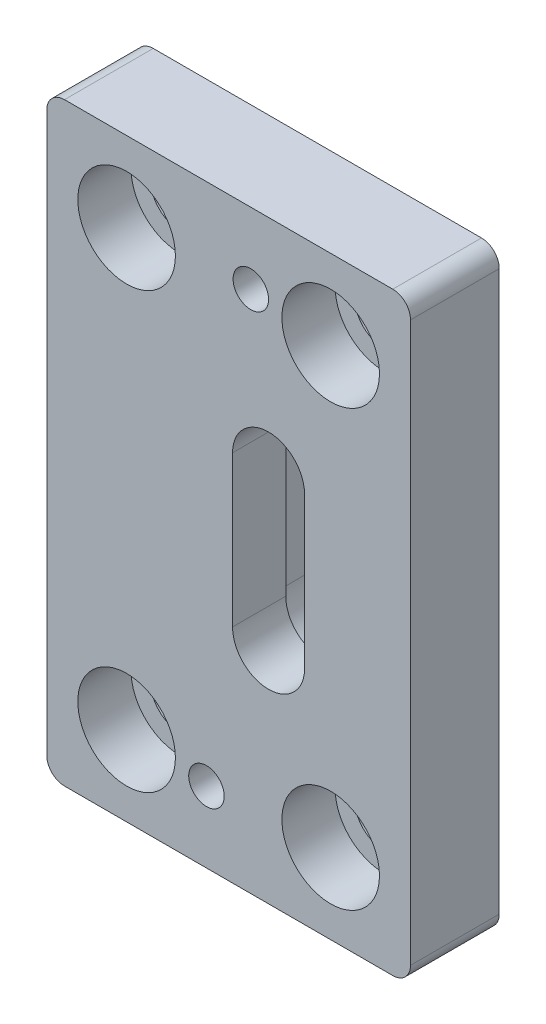
ISO-10303-21;
HEADER;
FILE_DESCRIPTION(('STEP AP214'),'2;1');
FILE_NAME('part.step','',(''),(''),'','','');
FILE_SCHEMA(('AUTOMOTIVE_DESIGN { 1 0 10303 214 1 1 1 1 }'));
ENDSEC;
DATA;
#1=APPLICATION_CONTEXT('core data for automotive mechanical design processes');
#2=APPLICATION_PROTOCOL_DEFINITION('international standard','automotive_design',2000,#1);
#3=PRODUCT_CONTEXT('',#1,'mechanical');
#4=PRODUCT('Part','Part','',(#3));
#5=PRODUCT_RELATED_PRODUCT_CATEGORY('part','',(#4));
#6=PRODUCT_DEFINITION_FORMATION('','',#4);
#7=PRODUCT_DEFINITION_CONTEXT('part definition',#1,'design');
#8=PRODUCT_DEFINITION('design','',#6,#7);
#9=PRODUCT_DEFINITION_SHAPE('','',#8);
#10=(LENGTH_UNIT() NAMED_UNIT(*) SI_UNIT(.MILLI.,.METRE.));
#11=(NAMED_UNIT(*) PLANE_ANGLE_UNIT() SI_UNIT($,.RADIAN.));
#12=(NAMED_UNIT(*) SI_UNIT($,.STERADIAN.) SOLID_ANGLE_UNIT());
#13=UNCERTAINTY_MEASURE_WITH_UNIT(LENGTH_MEASURE(1.E-05),#10,'distance_accuracy_value','');
#14=(GEOMETRIC_REPRESENTATION_CONTEXT(3) GLOBAL_UNCERTAINTY_ASSIGNED_CONTEXT((#13)) GLOBAL_UNIT_ASSIGNED_CONTEXT((#10,
#11,#12)) REPRESENTATION_CONTEXT('',''));
#15=CARTESIAN_POINT('',(0.,0.,0.));
#16=DIRECTION('',(0.,0.,1.));
#17=DIRECTION('',(1.,0.,0.));
#18=AXIS2_PLACEMENT_3D('',#15,#16,#17);
#19=CARTESIAN_POINT('',(-23.,45.,-10.));
#20=DIRECTION('',(0.,0.,1.));
#21=DIRECTION('',(1.,0.,0.));
#22=AXIS2_PLACEMENT_3D('',#19,#20,#21);
#23=CYLINDRICAL_SURFACE('',#22,2.);
#24=CARTESIAN_POINT('',(-23.,45.,0.));
#25=DIRECTION('',(0.,0.,1.));
#26=DIRECTION('',(1.,0.,0.));
#27=AXIS2_PLACEMENT_3D('',#24,#25,#26);
#28=CIRCLE('',#27,2.);
#29=CARTESIAN_POINT('',(-23.,47.,0.));
#30=VERTEX_POINT('',#29);
#31=CARTESIAN_POINT('',(-25.,45.,0.));
#32=VERTEX_POINT('',#31);
#33=EDGE_CURVE('E215',#30,#32,#28,.T.);
#34=ORIENTED_EDGE('',*,*,#33,.F.);
#35=DIRECTION('',(0.,0.,1.));
#36=VECTOR('',#35,1.);
#37=CARTESIAN_POINT('',(-23.,47.,-10.));
#38=LINE('',#37,#36);
#39=CARTESIAN_POINT('',(-23.,47.,-10.));
#40=VERTEX_POINT('',#39);
#41=EDGE_CURVE('E46',#40,#30,#38,.T.);
#42=ORIENTED_EDGE('',*,*,#41,.F.);
#43=CARTESIAN_POINT('',(-23.,45.,-10.));
#44=DIRECTION('',(0.,0.,1.));
#45=DIRECTION('',(1.,0.,0.));
#46=AXIS2_PLACEMENT_3D('',#43,#44,#45);
#47=CIRCLE('',#46,2.);
#48=CARTESIAN_POINT('',(-25.,45.,-10.));
#49=VERTEX_POINT('',#48);
#50=EDGE_CURVE('E221',#40,#49,#47,.T.);
#51=ORIENTED_EDGE('',*,*,#50,.T.);
#52=DIRECTION('',(0.,0.,1.));
#53=VECTOR('',#52,1.);
#54=CARTESIAN_POINT('',(-25.,45.,-10.));
#55=LINE('',#54,#53);
#56=EDGE_CURVE('E246',#49,#32,#55,.T.);
#57=ORIENTED_EDGE('',*,*,#56,.T.);
#58=EDGE_LOOP('',(#34,#42,#51,#57));
#59=FACE_BOUND('',#58,.T.);
#60=ADVANCED_FACE('F39',(#59),#23,.T.);
#61=CARTESIAN_POINT('',(-23.,47.,-10.));
#62=DIRECTION('',(0.,1.,0.));
#63=DIRECTION('',(0.,0.,1.));
#64=AXIS2_PLACEMENT_3D('',#61,#62,#63);
#65=PLANE('',#64);
#66=DIRECTION('',(-1.,0.,0.));
#67=VECTOR('',#66,1.);
#68=CARTESIAN_POINT('',(-23.,47.,0.));
#69=LINE('',#68,#67);
#70=CARTESIAN_POINT('',(14.,47.,0.));
#71=VERTEX_POINT('',#70);
#72=EDGE_CURVE('E225',#71,#30,#69,.T.);
#73=ORIENTED_EDGE('',*,*,#72,.F.);
#74=DIRECTION('',(0.,0.,1.));
#75=VECTOR('',#74,1.);
#76=CARTESIAN_POINT('',(14.,47.,-10.));
#77=LINE('',#76,#75);
#78=CARTESIAN_POINT('',(14.,47.,-10.));
#79=VERTEX_POINT('',#78);
#80=EDGE_CURVE('E270',#79,#71,#77,.T.);
#81=ORIENTED_EDGE('',*,*,#80,.F.);
#82=DIRECTION('',(-1.,0.,0.));
#83=VECTOR('',#82,1.);
#84=CARTESIAN_POINT('',(-23.,47.,-10.));
#85=LINE('',#84,#83);
#86=EDGE_CURVE('E243',#79,#40,#85,.T.);
#87=ORIENTED_EDGE('',*,*,#86,.T.);
#88=ORIENTED_EDGE('',*,*,#41,.T.);
#89=EDGE_LOOP('',(#73,#81,#87,#88));
#90=FACE_BOUND('',#89,.T.);
#91=ADVANCED_FACE('F294',(#90),#65,.T.);
#92=CARTESIAN_POINT('',(14.,45.,-10.));
#93=DIRECTION('',(0.,0.,1.));
#94=DIRECTION('',(1.,0.,0.));
#95=AXIS2_PLACEMENT_3D('',#92,#93,#94);
#96=CYLINDRICAL_SURFACE('',#95,2.);
#97=CARTESIAN_POINT('',(14.,45.,0.));
#98=DIRECTION('',(0.,0.,1.));
#99=DIRECTION('',(-1.,0.,0.));
#100=AXIS2_PLACEMENT_3D('',#97,#98,#99);
#101=CIRCLE('',#100,2.);
#102=CARTESIAN_POINT('',(16.,45.,0.));
#103=VERTEX_POINT('',#102);
#104=EDGE_CURVE('E264',#103,#71,#101,.T.);
#105=ORIENTED_EDGE('',*,*,#104,.F.);
#106=DIRECTION('',(0.,0.,1.));
#107=VECTOR('',#106,1.);
#108=CARTESIAN_POINT('',(16.,45.,-10.));
#109=LINE('',#108,#107);
#110=CARTESIAN_POINT('',(16.,45.,-10.));
#111=VERTEX_POINT('',#110);
#112=EDGE_CURVE('E272',#111,#103,#109,.T.);
#113=ORIENTED_EDGE('',*,*,#112,.F.);
#114=CARTESIAN_POINT('',(14.,45.,-10.));
#115=DIRECTION('',(0.,0.,1.));
#116=DIRECTION('',(-1.,0.,0.));
#117=AXIS2_PLACEMENT_3D('',#114,#115,#116);
#118=CIRCLE('',#117,2.);
#119=EDGE_CURVE('E240',#111,#79,#118,.T.);
#120=ORIENTED_EDGE('',*,*,#119,.T.);
#121=ORIENTED_EDGE('',*,*,#80,.T.);
#122=EDGE_LOOP('',(#105,#113,#120,#121));
#123=FACE_BOUND('',#122,.T.);
#124=ADVANCED_FACE('F313',(#123),#96,.T.);
#125=CARTESIAN_POINT('',(16.,45.,-10.));
#126=DIRECTION('',(1.,0.,0.));
#127=DIRECTION('',(0.,0.,-1.));
#128=AXIS2_PLACEMENT_3D('',#125,#126,#127);
#129=PLANE('',#128);
#130=DIRECTION('',(0.,1.,0.));
#131=VECTOR('',#130,1.);
#132=CARTESIAN_POINT('',(16.,45.,0.));
#133=LINE('',#132,#131);
#134=CARTESIAN_POINT('',(16.,-18.,0.));
#135=VERTEX_POINT('',#134);
#136=EDGE_CURVE('E261',#135,#103,#133,.T.);
#137=ORIENTED_EDGE('',*,*,#136,.F.);
#138=DIRECTION('',(0.,0.,1.));
#139=VECTOR('',#138,1.);
#140=CARTESIAN_POINT('',(16.,-18.,-10.));
#141=LINE('',#140,#139);
#142=CARTESIAN_POINT('',(16.,-18.,-10.));
#143=VERTEX_POINT('',#142);
#144=EDGE_CURVE('E274',#143,#135,#141,.T.);
#145=ORIENTED_EDGE('',*,*,#144,.F.);
#146=DIRECTION('',(0.,1.,0.));
#147=VECTOR('',#146,1.);
#148=CARTESIAN_POINT('',(16.,45.,-10.));
#149=LINE('',#148,#147);
#150=EDGE_CURVE('E237',#143,#111,#149,.T.);
#151=ORIENTED_EDGE('',*,*,#150,.T.);
#152=ORIENTED_EDGE('',*,*,#112,.T.);
#153=EDGE_LOOP('',(#137,#145,#151,#152));
#154=FACE_BOUND('',#153,.T.);
#155=ADVANCED_FACE('F311',(#154),#129,.T.);
#156=CARTESIAN_POINT('',(14.,-18.,-10.));
#157=DIRECTION('',(0.,0.,1.));
#158=DIRECTION('',(1.,0.,0.));
#159=AXIS2_PLACEMENT_3D('',#156,#157,#158);
#160=CYLINDRICAL_SURFACE('',#159,2.);
#161=CARTESIAN_POINT('',(14.,-18.,0.));
#162=DIRECTION('',(0.,0.,1.));
#163=DIRECTION('',(1.,0.,0.));
#164=AXIS2_PLACEMENT_3D('',#161,#162,#163);
#165=CIRCLE('',#164,2.);
#166=CARTESIAN_POINT('',(14.,-20.,0.));
#167=VERTEX_POINT('',#166);
#168=EDGE_CURVE('E258',#167,#135,#165,.T.);
#169=ORIENTED_EDGE('',*,*,#168,.F.);
#170=DIRECTION('',(0.,0.,1.));
#171=VECTOR('',#170,1.);
#172=CARTESIAN_POINT('',(14.,-20.,-10.));
#173=LINE('',#172,#171);
#174=CARTESIAN_POINT('',(14.,-20.,-10.));
#175=VERTEX_POINT('',#174);
#176=EDGE_CURVE('E276',#175,#167,#173,.T.);
#177=ORIENTED_EDGE('',*,*,#176,.F.);
#178=CARTESIAN_POINT('',(14.,-18.,-10.));
#179=DIRECTION('',(0.,0.,1.));
#180=DIRECTION('',(1.,0.,0.));
#181=AXIS2_PLACEMENT_3D('',#178,#179,#180);
#182=CIRCLE('',#181,2.);
#183=EDGE_CURVE('E234',#175,#143,#182,.T.);
#184=ORIENTED_EDGE('',*,*,#183,.T.);
#185=ORIENTED_EDGE('',*,*,#144,.T.);
#186=EDGE_LOOP('',(#169,#177,#184,#185));
#187=FACE_BOUND('',#186,.T.);
#188=ADVANCED_FACE('F307',(#187),#160,.T.);
#189=CARTESIAN_POINT('',(-23.,-20.,-10.));
#190=DIRECTION('',(0.,-1.,0.));
#191=DIRECTION('',(0.,0.,-1.));
#192=AXIS2_PLACEMENT_3D('',#189,#190,#191);
#193=PLANE('',#192);
#194=DIRECTION('',(1.,0.,0.));
#195=VECTOR('',#194,1.);
#196=CARTESIAN_POINT('',(-23.,-20.,0.));
#197=LINE('',#196,#195);
#198=CARTESIAN_POINT('',(-23.,-20.,0.));
#199=VERTEX_POINT('',#198);
#200=EDGE_CURVE('E255',#199,#167,#197,.T.);
#201=ORIENTED_EDGE('',*,*,#200,.F.);
#202=DIRECTION('',(0.,0.,1.));
#203=VECTOR('',#202,1.);
#204=CARTESIAN_POINT('',(-23.,-20.,-10.));
#205=LINE('',#204,#203);
#206=CARTESIAN_POINT('',(-23.,-20.,-10.));
#207=VERTEX_POINT('',#206);
#208=EDGE_CURVE('E278',#207,#199,#205,.T.);
#209=ORIENTED_EDGE('',*,*,#208,.F.);
#210=DIRECTION('',(1.,0.,0.));
#211=VECTOR('',#210,1.);
#212=CARTESIAN_POINT('',(-23.,-20.,-10.));
#213=LINE('',#212,#211);
#214=EDGE_CURVE('E231',#207,#175,#213,.T.);
#215=ORIENTED_EDGE('',*,*,#214,.T.);
#216=ORIENTED_EDGE('',*,*,#176,.T.);
#217=EDGE_LOOP('',(#201,#209,#215,#216));
#218=FACE_BOUND('',#217,.T.);
#219=ADVANCED_FACE('F305',(#218),#193,.T.);
#220=CARTESIAN_POINT('',(-23.,-18.,-10.));
#221=DIRECTION('',(0.,0.,1.));
#222=DIRECTION('',(1.,0.,0.));
#223=AXIS2_PLACEMENT_3D('',#220,#221,#222);
#224=CYLINDRICAL_SURFACE('',#223,2.);
#225=CARTESIAN_POINT('',(-23.,-18.,0.));
#226=DIRECTION('',(0.,0.,1.));
#227=DIRECTION('',(1.,0.,0.));
#228=AXIS2_PLACEMENT_3D('',#225,#226,#227);
#229=CIRCLE('',#228,2.);
#230=CARTESIAN_POINT('',(-25.,-18.,0.));
#231=VERTEX_POINT('',#230);
#232=EDGE_CURVE('E252',#231,#199,#229,.T.);
#233=ORIENTED_EDGE('',*,*,#232,.F.);
#234=DIRECTION('',(0.,0.,1.));
#235=VECTOR('',#234,1.);
#236=CARTESIAN_POINT('',(-25.,-18.,-10.));
#237=LINE('',#236,#235);
#238=CARTESIAN_POINT('',(-25.,-18.,-10.));
#239=VERTEX_POINT('',#238);
#240=EDGE_CURVE('E280',#239,#231,#237,.T.);
#241=ORIENTED_EDGE('',*,*,#240,.F.);
#242=CARTESIAN_POINT('',(-23.,-18.,-10.));
#243=DIRECTION('',(0.,0.,1.));
#244=DIRECTION('',(1.,0.,0.));
#245=AXIS2_PLACEMENT_3D('',#242,#243,#244);
#246=CIRCLE('',#245,2.);
#247=EDGE_CURVE('E228',#239,#207,#246,.T.);
#248=ORIENTED_EDGE('',*,*,#247,.T.);
#249=ORIENTED_EDGE('',*,*,#208,.T.);
#250=EDGE_LOOP('',(#233,#241,#248,#249));
#251=FACE_BOUND('',#250,.T.);
#252=ADVANCED_FACE('F301',(#251),#224,.T.);
#253=CARTESIAN_POINT('',(-25.,45.,-10.));
#254=DIRECTION('',(-1.,0.,0.));
#255=DIRECTION('',(0.,-1.,0.));
#256=AXIS2_PLACEMENT_3D('',#253,#254,#255);
#257=PLANE('',#256);
#258=DIRECTION('',(0.,-1.,0.));
#259=VECTOR('',#258,1.);
#260=CARTESIAN_POINT('',(-25.,45.,0.));
#261=LINE('',#260,#259);
#262=EDGE_CURVE('E249',#32,#231,#261,.T.);
#263=ORIENTED_EDGE('',*,*,#262,.F.);
#264=ORIENTED_EDGE('',*,*,#56,.F.);
#265=DIRECTION('',(0.,-1.,0.));
#266=VECTOR('',#265,1.);
#267=CARTESIAN_POINT('',(-25.,45.,-10.));
#268=LINE('',#267,#266);
#269=EDGE_CURVE('E224',#49,#239,#268,.T.);
#270=ORIENTED_EDGE('',*,*,#269,.T.);
#271=ORIENTED_EDGE('',*,*,#240,.T.);
#272=EDGE_LOOP('',(#263,#264,#270,#271));
#273=FACE_BOUND('',#272,.T.);
#274=ADVANCED_FACE('F287',(#273),#257,.T.);
#275=CARTESIAN_POINT('',(-23.,45.,-10.));
#276=DIRECTION('',(0.,0.,1.));
#277=DIRECTION('',(1.,0.,0.));
#278=AXIS2_PLACEMENT_3D('',#275,#276,#277);
#279=PLANE('',#278);
#280=CARTESIAN_POINT('',(-2.,39.,-10.));
#281=DIRECTION('',(0.,0.,1.));
#282=DIRECTION('',(1.,0.,0.));
#283=AXIS2_PLACEMENT_3D('',#280,#281,#282);
#284=CIRCLE('',#283,1.99999999999999);
#285=CARTESIAN_POINT('',(0.,39.,-10.));
#286=VERTEX_POINT('',#285);
#287=EDGE_CURVE('E688',#286,#286,#284,.T.);
#288=ORIENTED_EDGE('',*,*,#287,.T.);
#289=EDGE_LOOP('',(#288));
#290=FACE_BOUND('',#289,.T.);
#291=CARTESIAN_POINT('',(-7.,-12.,-10.));
#292=DIRECTION('',(0.,0.,1.));
#293=DIRECTION('',(1.,0.,0.));
#294=AXIS2_PLACEMENT_3D('',#291,#292,#293);
#295=CIRCLE('',#294,1.99999999999999);
#296=CARTESIAN_POINT('',(-5.00000000000002,-12.,-10.));
#297=VERTEX_POINT('',#296);
#298=EDGE_CURVE('E698',#297,#297,#295,.T.);
#299=ORIENTED_EDGE('',*,*,#298,.T.);
#300=EDGE_LOOP('',(#299));
#301=FACE_BOUND('',#300,.T.);
#302=CARTESIAN_POINT('',(-16.,38.,-10.));
#303=DIRECTION('',(0.,0.,1.));
#304=DIRECTION('',(1.,0.,0.));
#305=AXIS2_PLACEMENT_3D('',#302,#303,#304);
#306=CIRCLE('',#305,3.3);
#307=CARTESIAN_POINT('',(-12.7,38.,-10.));
#308=VERTEX_POINT('',#307);
#309=EDGE_CURVE('E710',#308,#308,#306,.T.);
#310=ORIENTED_EDGE('',*,*,#309,.T.);
#311=EDGE_LOOP('',(#310));
#312=FACE_BOUND('',#311,.T.);
#313=CARTESIAN_POINT('',(7.,-11.,-10.));
#314=DIRECTION('',(0.,0.,1.));
#315=DIRECTION('',(1.,0.,0.));
#316=AXIS2_PLACEMENT_3D('',#313,#314,#315);
#317=CIRCLE('',#316,3.3);
#318=CARTESIAN_POINT('',(10.3,-11.,-10.));
#319=VERTEX_POINT('',#318);
#320=EDGE_CURVE('E722',#319,#319,#317,.T.);
#321=ORIENTED_EDGE('',*,*,#320,.T.);
#322=EDGE_LOOP('',(#321));
#323=FACE_BOUND('',#322,.T.);
#324=CARTESIAN_POINT('',(-16.,-11.,-10.));
#325=DIRECTION('',(0.,0.,1.));
#326=DIRECTION('',(1.,0.,0.));
#327=AXIS2_PLACEMENT_3D('',#324,#325,#326);
#328=CIRCLE('',#327,3.3);
#329=CARTESIAN_POINT('',(-12.7,-11.,-10.));
#330=VERTEX_POINT('',#329);
#331=EDGE_CURVE('E734',#330,#330,#328,.T.);
#332=ORIENTED_EDGE('',*,*,#331,.T.);
#333=EDGE_LOOP('',(#332));
#334=FACE_BOUND('',#333,.T.);
#335=CARTESIAN_POINT('',(7.00000000000001,38.,-10.));
#336=DIRECTION('',(0.,0.,1.));
#337=DIRECTION('',(1.,0.,0.));
#338=AXIS2_PLACEMENT_3D('',#335,#336,#337);
#339=CIRCLE('',#338,3.3);
#340=CARTESIAN_POINT('',(10.3,38.,-10.));
#341=VERTEX_POINT('',#340);
#342=EDGE_CURVE('E178',#341,#341,#339,.T.);
#343=ORIENTED_EDGE('',*,*,#342,.T.);
#344=EDGE_LOOP('',(#343));
#345=FACE_BOUND('',#344,.T.);
#346=DIRECTION('',(0.,1.,0.));
#347=VECTOR('',#346,1.);
#348=CARTESIAN_POINT('',(5.06,5.00000000000001,-10.));
#349=LINE('',#348,#347);
#350=CARTESIAN_POINT('',(5.06,5.00000000000001,-10.));
#351=VERTEX_POINT('',#350);
#352=CARTESIAN_POINT('',(5.06,22.,-10.));
#353=VERTEX_POINT('',#352);
#354=EDGE_CURVE('E162',#351,#353,#349,.T.);
#355=ORIENTED_EDGE('',*,*,#354,.T.);
#356=CARTESIAN_POINT('',(0.,22.,-10.));
#357=DIRECTION('',(0.,0.,1.));
#358=DIRECTION('',(1.,0.,0.));
#359=AXIS2_PLACEMENT_3D('',#356,#357,#358);
#360=CIRCLE('',#359,5.06);
#361=CARTESIAN_POINT('',(-5.06000000000001,22.,-10.));
#362=VERTEX_POINT('',#361);
#363=EDGE_CURVE('E154',#353,#362,#360,.T.);
#364=ORIENTED_EDGE('',*,*,#363,.T.);
#365=DIRECTION('',(0.,-1.,0.));
#366=VECTOR('',#365,1.);
#367=CARTESIAN_POINT('',(-5.06000000000001,22.,-10.));
#368=LINE('',#367,#366);
#369=CARTESIAN_POINT('',(-5.06,5.00000000000002,-10.));
#370=VERTEX_POINT('',#369);
#371=EDGE_CURVE('E165',#362,#370,#368,.T.);
#372=ORIENTED_EDGE('',*,*,#371,.T.);
#373=CARTESIAN_POINT('',(0.,5.00000000000001,-10.));
#374=DIRECTION('',(0.,0.,1.));
#375=DIRECTION('',(1.,0.,0.));
#376=AXIS2_PLACEMENT_3D('',#373,#374,#375);
#377=CIRCLE('',#376,5.06);
#378=EDGE_CURVE('E53',#370,#351,#377,.T.);
#379=ORIENTED_EDGE('',*,*,#378,.T.);
#380=EDGE_LOOP('',(#355,#364,#372,#379));
#381=FACE_BOUND('',#380,.T.);
#382=ORIENTED_EDGE('',*,*,#50,.F.);
#383=ORIENTED_EDGE('',*,*,#86,.F.);
#384=ORIENTED_EDGE('',*,*,#119,.F.);
#385=ORIENTED_EDGE('',*,*,#150,.F.);
#386=ORIENTED_EDGE('',*,*,#183,.F.);
#387=ORIENTED_EDGE('',*,*,#214,.F.);
#388=ORIENTED_EDGE('',*,*,#247,.F.);
#389=ORIENTED_EDGE('',*,*,#269,.F.);
#390=EDGE_LOOP('',(#382,#383,#384,#385,#386,#387,#388,#389));
#391=FACE_BOUND('',#390,.T.);
#392=ADVANCED_FACE('F169',(#290,#301,#312,#323,#334,#345,#381,#391),#279,.F.);
#393=CARTESIAN_POINT('',(-23.,45.,0.));
#394=DIRECTION('',(0.,0.,1.));
#395=DIRECTION('',(1.,0.,0.));
#396=AXIS2_PLACEMENT_3D('',#393,#394,#395);
#397=PLANE('',#396);
#398=CARTESIAN_POINT('',(-2.,39.,0.));
#399=DIRECTION('',(0.,0.,1.));
#400=DIRECTION('',(1.,0.,0.));
#401=AXIS2_PLACEMENT_3D('',#398,#399,#400);
#402=CIRCLE('',#401,1.99999999999999);
#403=CARTESIAN_POINT('',(0.,39.,0.));
#404=VERTEX_POINT('',#403);
#405=EDGE_CURVE('E691',#404,#404,#402,.T.);
#406=ORIENTED_EDGE('',*,*,#405,.F.);
#407=EDGE_LOOP('',(#406));
#408=FACE_BOUND('',#407,.T.);
#409=CARTESIAN_POINT('',(-7.,-12.,0.));
#410=DIRECTION('',(0.,0.,1.));
#411=DIRECTION('',(1.,0.,0.));
#412=AXIS2_PLACEMENT_3D('',#409,#410,#411);
#413=CIRCLE('',#412,1.99999999999999);
#414=CARTESIAN_POINT('',(-5.00000000000002,-12.,0.));
#415=VERTEX_POINT('',#414);
#416=EDGE_CURVE('E693',#415,#415,#413,.T.);
#417=ORIENTED_EDGE('',*,*,#416,.F.);
#418=EDGE_LOOP('',(#417));
#419=FACE_BOUND('',#418,.T.);
#420=CARTESIAN_POINT('',(-16.,38.,0.));
#421=DIRECTION('',(0.,0.,1.));
#422=DIRECTION('',(1.,0.,0.));
#423=AXIS2_PLACEMENT_3D('',#420,#421,#422);
#424=CIRCLE('',#423,5.49999999999999);
#425=CARTESIAN_POINT('',(-10.5,38.,0.));
#426=VERTEX_POINT('',#425);
#427=EDGE_CURVE('E701',#426,#426,#424,.T.);
#428=ORIENTED_EDGE('',*,*,#427,.F.);
#429=EDGE_LOOP('',(#428));
#430=FACE_BOUND('',#429,.T.);
#431=CARTESIAN_POINT('',(7.,-11.,0.));
#432=DIRECTION('',(0.,0.,1.));
#433=DIRECTION('',(1.,0.,0.));
#434=AXIS2_PLACEMENT_3D('',#431,#432,#433);
#435=CIRCLE('',#434,5.49999999999999);
#436=CARTESIAN_POINT('',(12.5,-11.,0.));
#437=VERTEX_POINT('',#436);
#438=EDGE_CURVE('E713',#437,#437,#435,.T.);
#439=ORIENTED_EDGE('',*,*,#438,.F.);
#440=EDGE_LOOP('',(#439));
#441=FACE_BOUND('',#440,.T.);
#442=CARTESIAN_POINT('',(-16.,-11.,0.));
#443=DIRECTION('',(0.,0.,1.));
#444=DIRECTION('',(1.,0.,0.));
#445=AXIS2_PLACEMENT_3D('',#442,#443,#444);
#446=CIRCLE('',#445,5.49999999999999);
#447=CARTESIAN_POINT('',(-10.5,-11.,0.));
#448=VERTEX_POINT('',#447);
#449=EDGE_CURVE('E725',#448,#448,#446,.T.);
#450=ORIENTED_EDGE('',*,*,#449,.F.);
#451=EDGE_LOOP('',(#450));
#452=FACE_BOUND('',#451,.T.);
#453=CARTESIAN_POINT('',(7.00000000000001,38.,0.));
#454=DIRECTION('',(0.,0.,1.));
#455=DIRECTION('',(1.,0.,0.));
#456=AXIS2_PLACEMENT_3D('',#453,#454,#455);
#457=CIRCLE('',#456,5.49999999999999);
#458=CARTESIAN_POINT('',(12.5,38.,0.));
#459=VERTEX_POINT('',#458);
#460=EDGE_CURVE('E737',#459,#459,#457,.T.);
#461=ORIENTED_EDGE('',*,*,#460,.F.);
#462=EDGE_LOOP('',(#461));
#463=FACE_BOUND('',#462,.T.);
#464=CARTESIAN_POINT('',(0.,22.,0.));
#465=DIRECTION('',(0.,0.,1.));
#466=DIRECTION('',(1.,0.,0.));
#467=AXIS2_PLACEMENT_3D('',#464,#465,#466);
#468=CIRCLE('',#467,4.06);
#469=CARTESIAN_POINT('',(4.06,22.,0.));
#470=VERTEX_POINT('',#469);
#471=CARTESIAN_POINT('',(-4.06000000000001,22.,0.));
#472=VERTEX_POINT('',#471);
#473=EDGE_CURVE('E200',#470,#472,#468,.T.);
#474=ORIENTED_EDGE('',*,*,#473,.F.);
#475=DIRECTION('',(0.,1.,0.));
#476=VECTOR('',#475,1.);
#477=CARTESIAN_POINT('',(4.06,5.00000000000001,0.));
#478=LINE('',#477,#476);
#479=CARTESIAN_POINT('',(4.06,5.00000000000001,0.));
#480=VERTEX_POINT('',#479);
#481=EDGE_CURVE('E209',#480,#470,#478,.T.);
#482=ORIENTED_EDGE('',*,*,#481,.F.);
#483=CARTESIAN_POINT('',(0.,5.00000000000001,0.));
#484=DIRECTION('',(0.,0.,1.));
#485=DIRECTION('',(1.,0.,0.));
#486=AXIS2_PLACEMENT_3D('',#483,#484,#485);
#487=CIRCLE('',#486,4.06);
#488=CARTESIAN_POINT('',(-4.06,5.00000000000002,0.));
#489=VERTEX_POINT('',#488);
#490=EDGE_CURVE('E206',#489,#480,#487,.T.);
#491=ORIENTED_EDGE('',*,*,#490,.F.);
#492=DIRECTION('',(0.,-1.,0.));
#493=VECTOR('',#492,1.);
#494=CARTESIAN_POINT('',(-4.06,22.,0.));
#495=LINE('',#494,#493);
#496=EDGE_CURVE('E203',#472,#489,#495,.T.);
#497=ORIENTED_EDGE('',*,*,#496,.F.);
#498=EDGE_LOOP('',(#474,#482,#491,#497));
#499=FACE_BOUND('',#498,.T.);
#500=ORIENTED_EDGE('',*,*,#33,.T.);
#501=ORIENTED_EDGE('',*,*,#262,.T.);
#502=ORIENTED_EDGE('',*,*,#232,.T.);
#503=ORIENTED_EDGE('',*,*,#200,.T.);
#504=ORIENTED_EDGE('',*,*,#168,.T.);
#505=ORIENTED_EDGE('',*,*,#136,.T.);
#506=ORIENTED_EDGE('',*,*,#104,.T.);
#507=ORIENTED_EDGE('',*,*,#72,.T.);
#508=EDGE_LOOP('',(#500,#501,#502,#503,#504,#505,#506,#507));
#509=FACE_BOUND('',#508,.T.);
#510=ADVANCED_FACE('F290',(#408,#419,#430,#441,#452,#463,#499,#509),#397,.T.);
#511=CARTESIAN_POINT('',(0.,22.,-10.));
#512=DIRECTION('',(0.,0.,1.));
#513=DIRECTION('',(1.,0.,0.));
#514=AXIS2_PLACEMENT_3D('',#511,#512,#513);
#515=CYLINDRICAL_SURFACE('',#514,4.06);
#516=DIRECTION('',(0.,0.,1.));
#517=VECTOR('',#516,1.);
#518=CARTESIAN_POINT('',(-4.06,22.,-10.));
#519=LINE('',#518,#517);
#520=CARTESIAN_POINT('',(-4.06,22.,-6.));
#521=VERTEX_POINT('',#520);
#522=EDGE_CURVE('E212',#521,#472,#519,.T.);
#523=ORIENTED_EDGE('',*,*,#522,.F.);
#524=CARTESIAN_POINT('',(0.,22.,-6.));
#525=DIRECTION('',(0.,0.,1.));
#526=DIRECTION('',(1.,0.,0.));
#527=AXIS2_PLACEMENT_3D('',#524,#525,#526);
#528=CIRCLE('',#527,4.06);
#529=CARTESIAN_POINT('',(4.06,22.,-6.));
#530=VERTEX_POINT('',#529);
#531=EDGE_CURVE('E61',#521,#530,#528,.F.);
#532=ORIENTED_EDGE('',*,*,#531,.T.);
#533=DIRECTION('',(0.,0.,1.));
#534=VECTOR('',#533,1.);
#535=CARTESIAN_POINT('',(4.06,22.,-10.));
#536=LINE('',#535,#534);
#537=EDGE_CURVE('E213',#530,#470,#536,.T.);
#538=ORIENTED_EDGE('',*,*,#537,.T.);
#539=ORIENTED_EDGE('',*,*,#473,.T.);
#540=EDGE_LOOP('',(#523,#532,#538,#539));
#541=FACE_BOUND('',#540,.T.);
#542=ADVANCED_FACE('F384',(#541),#515,.F.);
#543=CARTESIAN_POINT('',(4.06,5.00000000000001,-10.));
#544=DIRECTION('',(1.,0.,0.));
#545=DIRECTION('',(0.,1.,0.));
#546=AXIS2_PLACEMENT_3D('',#543,#544,#545);
#547=PLANE('',#546);
#548=ORIENTED_EDGE('',*,*,#537,.F.);
#549=DIRECTION('',(0.,-1.,0.));
#550=VECTOR('',#549,1.);
#551=CARTESIAN_POINT('',(4.06,5.00000000000001,-6.));
#552=LINE('',#551,#550);
#553=CARTESIAN_POINT('',(4.06,5.00000000000001,-6.));
#554=VERTEX_POINT('',#553);
#555=EDGE_CURVE('E196',#530,#554,#552,.T.);
#556=ORIENTED_EDGE('',*,*,#555,.T.);
#557=DIRECTION('',(0.,0.,1.));
#558=VECTOR('',#557,1.);
#559=CARTESIAN_POINT('',(4.06,5.00000000000001,-10.));
#560=LINE('',#559,#558);
#561=EDGE_CURVE('E216',#554,#480,#560,.T.);
#562=ORIENTED_EDGE('',*,*,#561,.T.);
#563=ORIENTED_EDGE('',*,*,#481,.T.);
#564=EDGE_LOOP('',(#548,#556,#562,#563));
#565=FACE_BOUND('',#564,.T.);
#566=ADVANCED_FACE('F389',(#565),#547,.F.);
#567=CARTESIAN_POINT('',(0.,5.00000000000001,-10.));
#568=DIRECTION('',(0.,0.,1.));
#569=DIRECTION('',(1.,0.,0.));
#570=AXIS2_PLACEMENT_3D('',#567,#568,#569);
#571=CYLINDRICAL_SURFACE('',#570,4.06);
#572=ORIENTED_EDGE('',*,*,#561,.F.);
#573=CARTESIAN_POINT('',(0.,5.00000000000001,-6.));
#574=DIRECTION('',(0.,0.,1.));
#575=DIRECTION('',(1.,0.,0.));
#576=AXIS2_PLACEMENT_3D('',#573,#574,#575);
#577=CIRCLE('',#576,4.06);
#578=CARTESIAN_POINT('',(-4.06,5.00000000000002,-6.));
#579=VERTEX_POINT('',#578);
#580=EDGE_CURVE('E190',#554,#579,#577,.F.);
#581=ORIENTED_EDGE('',*,*,#580,.T.);
#582=DIRECTION('',(0.,0.,1.));
#583=VECTOR('',#582,1.);
#584=CARTESIAN_POINT('',(-4.06,5.00000000000002,-10.));
#585=LINE('',#584,#583);
#586=EDGE_CURVE('E218',#579,#489,#585,.T.);
#587=ORIENTED_EDGE('',*,*,#586,.T.);
#588=ORIENTED_EDGE('',*,*,#490,.T.);
#589=EDGE_LOOP('',(#572,#581,#587,#588));
#590=FACE_BOUND('',#589,.T.);
#591=ADVANCED_FACE('F402',(#590),#571,.F.);
#592=CARTESIAN_POINT('',(-4.06,22.,-10.));
#593=DIRECTION('',(-1.,0.,0.));
#594=DIRECTION('',(0.,-1.,0.));
#595=AXIS2_PLACEMENT_3D('',#592,#593,#594);
#596=PLANE('',#595);
#597=ORIENTED_EDGE('',*,*,#586,.F.);
#598=DIRECTION('',(0.,1.,0.));
#599=VECTOR('',#598,1.);
#600=CARTESIAN_POINT('',(-4.06,22.,-6.));
#601=LINE('',#600,#599);
#602=EDGE_CURVE('E11',#579,#521,#601,.T.);
#603=ORIENTED_EDGE('',*,*,#602,.T.);
#604=ORIENTED_EDGE('',*,*,#522,.T.);
#605=ORIENTED_EDGE('',*,*,#496,.T.);
#606=EDGE_LOOP('',(#597,#603,#604,#605));
#607=FACE_BOUND('',#606,.T.);
#608=ADVANCED_FACE('F413',(#607),#596,.F.);
#609=CARTESIAN_POINT('',(0.,22.,-6.));
#610=DIRECTION('',(0.,0.,1.));
#611=DIRECTION('',(1.,0.,0.));
#612=AXIS2_PLACEMENT_3D('',#609,#610,#611);
#613=PLANE('',#612);
#614=CARTESIAN_POINT('',(0.,22.,-6.));
#615=DIRECTION('',(0.,0.,1.));
#616=DIRECTION('',(1.,0.,0.));
#617=AXIS2_PLACEMENT_3D('',#614,#615,#616);
#618=CIRCLE('',#617,5.06);
#619=CARTESIAN_POINT('',(5.06,22.,-6.));
#620=VERTEX_POINT('',#619);
#621=CARTESIAN_POINT('',(-5.06000000000001,22.,-6.));
#622=VERTEX_POINT('',#621);
#623=EDGE_CURVE('E157',#620,#622,#618,.T.);
#624=ORIENTED_EDGE('',*,*,#623,.F.);
#625=DIRECTION('',(0.,1.,0.));
#626=VECTOR('',#625,1.);
#627=CARTESIAN_POINT('',(5.06,5.00000000000001,-6.));
#628=LINE('',#627,#626);
#629=CARTESIAN_POINT('',(5.06,5.00000000000001,-6.));
#630=VERTEX_POINT('',#629);
#631=EDGE_CURVE('E172',#630,#620,#628,.T.);
#632=ORIENTED_EDGE('',*,*,#631,.F.);
#633=CARTESIAN_POINT('',(0.,5.00000000000001,-6.));
#634=DIRECTION('',(0.,0.,1.));
#635=DIRECTION('',(1.,0.,0.));
#636=AXIS2_PLACEMENT_3D('',#633,#634,#635);
#637=CIRCLE('',#636,5.06);
#638=CARTESIAN_POINT('',(-5.06,5.00000000000002,-6.));
#639=VERTEX_POINT('',#638);
#640=EDGE_CURVE('E175',#639,#630,#637,.T.);
#641=ORIENTED_EDGE('',*,*,#640,.F.);
#642=DIRECTION('',(0.,-1.,0.));
#643=VECTOR('',#642,1.);
#644=CARTESIAN_POINT('',(-5.06000000000001,22.,-6.));
#645=LINE('',#644,#643);
#646=EDGE_CURVE('E184',#622,#639,#645,.T.);
#647=ORIENTED_EDGE('',*,*,#646,.F.);
#648=EDGE_LOOP('',(#624,#632,#641,#647));
#649=FACE_BOUND('',#648,.T.);
#650=ORIENTED_EDGE('',*,*,#602,.F.);
#651=ORIENTED_EDGE('',*,*,#580,.F.);
#652=ORIENTED_EDGE('',*,*,#555,.F.);
#653=ORIENTED_EDGE('',*,*,#531,.F.);
#654=EDGE_LOOP('',(#650,#651,#652,#653));
#655=FACE_BOUND('',#654,.T.);
#656=ADVANCED_FACE('F424',(#649,#655),#613,.F.);
#657=CARTESIAN_POINT('',(0.,22.,-10.));
#658=DIRECTION('',(0.,0.,1.));
#659=DIRECTION('',(1.,0.,0.));
#660=AXIS2_PLACEMENT_3D('',#657,#658,#659);
#661=CYLINDRICAL_SURFACE('',#660,5.06);
#662=ORIENTED_EDGE('',*,*,#623,.T.);
#663=DIRECTION('',(0.,0.,1.));
#664=VECTOR('',#663,1.);
#665=CARTESIAN_POINT('',(-5.06000000000001,22.,-10.));
#666=LINE('',#665,#664);
#667=EDGE_CURVE('E150',#362,#622,#666,.T.);
#668=ORIENTED_EDGE('',*,*,#667,.F.);
#669=ORIENTED_EDGE('',*,*,#363,.F.);
#670=DIRECTION('',(0.,0.,1.));
#671=VECTOR('',#670,1.);
#672=CARTESIAN_POINT('',(5.06,22.,-10.));
#673=LINE('',#672,#671);
#674=EDGE_CURVE('E188',#353,#620,#673,.T.);
#675=ORIENTED_EDGE('',*,*,#674,.T.);
#676=EDGE_LOOP('',(#662,#668,#669,#675));
#677=FACE_BOUND('',#676,.T.);
#678=ADVANCED_FACE('F152',(#677),#661,.F.);
#679=CARTESIAN_POINT('',(5.06,5.00000000000001,-10.));
#680=DIRECTION('',(1.,0.,0.));
#681=DIRECTION('',(0.,1.,0.));
#682=AXIS2_PLACEMENT_3D('',#679,#680,#681);
#683=PLANE('',#682);
#684=ORIENTED_EDGE('',*,*,#631,.T.);
#685=ORIENTED_EDGE('',*,*,#674,.F.);
#686=ORIENTED_EDGE('',*,*,#354,.F.);
#687=DIRECTION('',(0.,0.,1.));
#688=VECTOR('',#687,1.);
#689=CARTESIAN_POINT('',(5.06,5.00000000000001,-10.));
#690=LINE('',#689,#688);
#691=EDGE_CURVE('E191',#351,#630,#690,.T.);
#692=ORIENTED_EDGE('',*,*,#691,.T.);
#693=EDGE_LOOP('',(#684,#685,#686,#692));
#694=FACE_BOUND('',#693,.T.);
#695=ADVANCED_FACE('F445',(#694),#683,.F.);
#696=CARTESIAN_POINT('',(0.,5.00000000000001,-10.));
#697=DIRECTION('',(0.,0.,1.));
#698=DIRECTION('',(1.,0.,0.));
#699=AXIS2_PLACEMENT_3D('',#696,#697,#698);
#700=CYLINDRICAL_SURFACE('',#699,5.06);
#701=ORIENTED_EDGE('',*,*,#640,.T.);
#702=ORIENTED_EDGE('',*,*,#691,.F.);
#703=ORIENTED_EDGE('',*,*,#378,.F.);
#704=DIRECTION('',(0.,0.,1.));
#705=VECTOR('',#704,1.);
#706=CARTESIAN_POINT('',(-5.06,5.00000000000002,-10.));
#707=LINE('',#706,#705);
#708=EDGE_CURVE('E161',#370,#639,#707,.T.);
#709=ORIENTED_EDGE('',*,*,#708,.T.);
#710=EDGE_LOOP('',(#701,#702,#703,#709));
#711=FACE_BOUND('',#710,.T.);
#712=ADVANCED_FACE('F455',(#711),#700,.F.);
#713=CARTESIAN_POINT('',(-5.06000000000001,22.,-10.));
#714=DIRECTION('',(-1.,0.,0.));
#715=DIRECTION('',(0.,-1.,0.));
#716=AXIS2_PLACEMENT_3D('',#713,#714,#715);
#717=PLANE('',#716);
#718=ORIENTED_EDGE('',*,*,#646,.T.);
#719=ORIENTED_EDGE('',*,*,#708,.F.);
#720=ORIENTED_EDGE('',*,*,#371,.F.);
#721=ORIENTED_EDGE('',*,*,#667,.T.);
#722=EDGE_LOOP('',(#718,#719,#720,#721));
#723=FACE_BOUND('',#722,.T.);
#724=ADVANCED_FACE('F166',(#723),#717,.F.);
#725=CARTESIAN_POINT('',(7.00000000000001,38.,0.));
#726=DIRECTION('',(0.,0.,1.));
#727=DIRECTION('',(1.,0.,0.));
#728=AXIS2_PLACEMENT_3D('',#725,#726,#727);
#729=CYLINDRICAL_SURFACE('',#728,3.30000000000001);
#730=ORIENTED_EDGE('',*,*,#342,.F.);
#731=EDGE_LOOP('',(#730));
#732=FACE_BOUND('',#731,.T.);
#733=CARTESIAN_POINT('',(7.00000000000001,38.,-6.));
#734=DIRECTION('',(0.,0.,1.));
#735=DIRECTION('',(1.,0.,0.));
#736=AXIS2_PLACEMENT_3D('',#733,#734,#735);
#737=CIRCLE('',#736,3.30000000000001);
#738=CARTESIAN_POINT('',(10.3,38.,-6.));
#739=VERTEX_POINT('',#738);
#740=EDGE_CURVE('E742',#739,#739,#737,.T.);
#741=ORIENTED_EDGE('',*,*,#740,.T.);
#742=EDGE_LOOP('',(#741));
#743=FACE_BOUND('',#742,.T.);
#744=ADVANCED_FACE('F475',(#732,#743),#729,.F.);
#745=CARTESIAN_POINT('',(10.3,38.,-6.));
#746=DIRECTION('',(0.,0.,-1.));
#747=DIRECTION('',(-1.,0.,0.));
#748=AXIS2_PLACEMENT_3D('',#745,#746,#747);
#749=PLANE('',#748);
#750=ORIENTED_EDGE('',*,*,#740,.F.);
#751=EDGE_LOOP('',(#750));
#752=FACE_BOUND('',#751,.T.);
#753=CARTESIAN_POINT('',(7.00000000000001,38.,-6.));
#754=DIRECTION('',(0.,0.,1.));
#755=DIRECTION('',(1.,0.,0.));
#756=AXIS2_PLACEMENT_3D('',#753,#754,#755);
#757=CIRCLE('',#756,5.5);
#758=CARTESIAN_POINT('',(12.5,38.,-6.));
#759=VERTEX_POINT('',#758);
#760=EDGE_CURVE('E740',#759,#759,#757,.T.);
#761=ORIENTED_EDGE('',*,*,#760,.T.);
#762=EDGE_LOOP('',(#761));
#763=FACE_BOUND('',#762,.T.);
#764=ADVANCED_FACE('F485',(#752,#763),#749,.F.);
#765=CARTESIAN_POINT('',(7.00000000000001,38.,0.));
#766=DIRECTION('',(0.,0.,1.));
#767=DIRECTION('',(1.,0.,0.));
#768=AXIS2_PLACEMENT_3D('',#765,#766,#767);
#769=CYLINDRICAL_SURFACE('',#768,5.5);
#770=ORIENTED_EDGE('',*,*,#760,.F.);
#771=EDGE_LOOP('',(#770));
#772=FACE_BOUND('',#771,.T.);
#773=ORIENTED_EDGE('',*,*,#460,.T.);
#774=EDGE_LOOP('',(#773));
#775=FACE_BOUND('',#774,.T.);
#776=ADVANCED_FACE('F496',(#772,#775),#769,.F.);
#777=CARTESIAN_POINT('',(-16.,-11.,0.));
#778=DIRECTION('',(0.,0.,1.));
#779=DIRECTION('',(1.,0.,0.));
#780=AXIS2_PLACEMENT_3D('',#777,#778,#779);
#781=CYLINDRICAL_SURFACE('',#780,3.30000000000001);
#782=ORIENTED_EDGE('',*,*,#331,.F.);
#783=EDGE_LOOP('',(#782));
#784=FACE_BOUND('',#783,.T.);
#785=CARTESIAN_POINT('',(-16.,-11.,-6.));
#786=DIRECTION('',(0.,0.,1.));
#787=DIRECTION('',(1.,0.,0.));
#788=AXIS2_PLACEMENT_3D('',#785,#786,#787);
#789=CIRCLE('',#788,3.30000000000001);
#790=CARTESIAN_POINT('',(-12.7,-11.,-6.));
#791=VERTEX_POINT('',#790);
#792=EDGE_CURVE('E731',#791,#791,#789,.T.);
#793=ORIENTED_EDGE('',*,*,#792,.T.);
#794=EDGE_LOOP('',(#793));
#795=FACE_BOUND('',#794,.T.);
#796=ADVANCED_FACE('F507',(#784,#795),#781,.F.);
#797=CARTESIAN_POINT('',(-12.7,-11.,-6.));
#798=DIRECTION('',(0.,0.,-1.));
#799=DIRECTION('',(-1.,0.,0.));
#800=AXIS2_PLACEMENT_3D('',#797,#798,#799);
#801=PLANE('',#800);
#802=ORIENTED_EDGE('',*,*,#792,.F.);
#803=EDGE_LOOP('',(#802));
#804=FACE_BOUND('',#803,.T.);
#805=CARTESIAN_POINT('',(-16.,-11.,-6.));
#806=DIRECTION('',(0.,0.,1.));
#807=DIRECTION('',(1.,0.,0.));
#808=AXIS2_PLACEMENT_3D('',#805,#806,#807);
#809=CIRCLE('',#808,5.5);
#810=CARTESIAN_POINT('',(-10.5,-11.,-6.));
#811=VERTEX_POINT('',#810);
#812=EDGE_CURVE('E728',#811,#811,#809,.T.);
#813=ORIENTED_EDGE('',*,*,#812,.T.);
#814=EDGE_LOOP('',(#813));
#815=FACE_BOUND('',#814,.T.);
#816=ADVANCED_FACE('F518',(#804,#815),#801,.F.);
#817=CARTESIAN_POINT('',(-16.,-11.,0.));
#818=DIRECTION('',(0.,0.,1.));
#819=DIRECTION('',(1.,0.,0.));
#820=AXIS2_PLACEMENT_3D('',#817,#818,#819);
#821=CYLINDRICAL_SURFACE('',#820,5.5);
#822=ORIENTED_EDGE('',*,*,#812,.F.);
#823=EDGE_LOOP('',(#822));
#824=FACE_BOUND('',#823,.T.);
#825=ORIENTED_EDGE('',*,*,#449,.T.);
#826=EDGE_LOOP('',(#825));
#827=FACE_BOUND('',#826,.T.);
#828=ADVANCED_FACE('F529',(#824,#827),#821,.F.);
#829=CARTESIAN_POINT('',(7.,-11.,0.));
#830=DIRECTION('',(0.,0.,1.));
#831=DIRECTION('',(1.,0.,0.));
#832=AXIS2_PLACEMENT_3D('',#829,#830,#831);
#833=CYLINDRICAL_SURFACE('',#832,3.30000000000001);
#834=ORIENTED_EDGE('',*,*,#320,.F.);
#835=EDGE_LOOP('',(#834));
#836=FACE_BOUND('',#835,.T.);
#837=CARTESIAN_POINT('',(7.,-11.,-6.));
#838=DIRECTION('',(0.,0.,1.));
#839=DIRECTION('',(1.,0.,0.));
#840=AXIS2_PLACEMENT_3D('',#837,#838,#839);
#841=CIRCLE('',#840,3.30000000000001);
#842=CARTESIAN_POINT('',(10.3,-11.,-6.));
#843=VERTEX_POINT('',#842);
#844=EDGE_CURVE('E719',#843,#843,#841,.T.);
#845=ORIENTED_EDGE('',*,*,#844,.T.);
#846=EDGE_LOOP('',(#845));
#847=FACE_BOUND('',#846,.T.);
#848=ADVANCED_FACE('F540',(#836,#847),#833,.F.);
#849=CARTESIAN_POINT('',(10.3,-11.,-6.));
#850=DIRECTION('',(0.,0.,-1.));
#851=DIRECTION('',(-1.,0.,0.));
#852=AXIS2_PLACEMENT_3D('',#849,#850,#851);
#853=PLANE('',#852);
#854=ORIENTED_EDGE('',*,*,#844,.F.);
#855=EDGE_LOOP('',(#854));
#856=FACE_BOUND('',#855,.T.);
#857=CARTESIAN_POINT('',(7.,-11.,-6.));
#858=DIRECTION('',(0.,0.,1.));
#859=DIRECTION('',(1.,0.,0.));
#860=AXIS2_PLACEMENT_3D('',#857,#858,#859);
#861=CIRCLE('',#860,5.5);
#862=CARTESIAN_POINT('',(12.5,-11.,-6.));
#863=VERTEX_POINT('',#862);
#864=EDGE_CURVE('E716',#863,#863,#861,.T.);
#865=ORIENTED_EDGE('',*,*,#864,.T.);
#866=EDGE_LOOP('',(#865));
#867=FACE_BOUND('',#866,.T.);
#868=ADVANCED_FACE('F551',(#856,#867),#853,.F.);
#869=CARTESIAN_POINT('',(7.,-11.,0.));
#870=DIRECTION('',(0.,0.,1.));
#871=DIRECTION('',(1.,0.,0.));
#872=AXIS2_PLACEMENT_3D('',#869,#870,#871);
#873=CYLINDRICAL_SURFACE('',#872,5.5);
#874=ORIENTED_EDGE('',*,*,#864,.F.);
#875=EDGE_LOOP('',(#874));
#876=FACE_BOUND('',#875,.T.);
#877=ORIENTED_EDGE('',*,*,#438,.T.);
#878=EDGE_LOOP('',(#877));
#879=FACE_BOUND('',#878,.T.);
#880=ADVANCED_FACE('F562',(#876,#879),#873,.F.);
#881=CARTESIAN_POINT('',(-16.,38.,0.));
#882=DIRECTION('',(0.,0.,1.));
#883=DIRECTION('',(1.,0.,0.));
#884=AXIS2_PLACEMENT_3D('',#881,#882,#883);
#885=CYLINDRICAL_SURFACE('',#884,3.30000000000001);
#886=ORIENTED_EDGE('',*,*,#309,.F.);
#887=EDGE_LOOP('',(#886));
#888=FACE_BOUND('',#887,.T.);
#889=CARTESIAN_POINT('',(-16.,38.,-6.));
#890=DIRECTION('',(0.,0.,1.));
#891=DIRECTION('',(1.,0.,0.));
#892=AXIS2_PLACEMENT_3D('',#889,#890,#891);
#893=CIRCLE('',#892,3.30000000000001);
#894=CARTESIAN_POINT('',(-12.7,38.,-6.));
#895=VERTEX_POINT('',#894);
#896=EDGE_CURVE('E707',#895,#895,#893,.T.);
#897=ORIENTED_EDGE('',*,*,#896,.T.);
#898=EDGE_LOOP('',(#897));
#899=FACE_BOUND('',#898,.T.);
#900=ADVANCED_FACE('F573',(#888,#899),#885,.F.);
#901=CARTESIAN_POINT('',(-12.7,38.,-6.));
#902=DIRECTION('',(0.,0.,-1.));
#903=DIRECTION('',(-1.,0.,0.));
#904=AXIS2_PLACEMENT_3D('',#901,#902,#903);
#905=PLANE('',#904);
#906=ORIENTED_EDGE('',*,*,#896,.F.);
#907=EDGE_LOOP('',(#906));
#908=FACE_BOUND('',#907,.T.);
#909=CARTESIAN_POINT('',(-16.,38.,-6.));
#910=DIRECTION('',(0.,0.,1.));
#911=DIRECTION('',(1.,0.,0.));
#912=AXIS2_PLACEMENT_3D('',#909,#910,#911);
#913=CIRCLE('',#912,5.5);
#914=CARTESIAN_POINT('',(-10.5,38.,-6.));
#915=VERTEX_POINT('',#914);
#916=EDGE_CURVE('E704',#915,#915,#913,.T.);
#917=ORIENTED_EDGE('',*,*,#916,.T.);
#918=EDGE_LOOP('',(#917));
#919=FACE_BOUND('',#918,.T.);
#920=ADVANCED_FACE('F584',(#908,#919),#905,.F.);
#921=CARTESIAN_POINT('',(-16.,38.,0.));
#922=DIRECTION('',(0.,0.,1.));
#923=DIRECTION('',(1.,0.,0.));
#924=AXIS2_PLACEMENT_3D('',#921,#922,#923);
#925=CYLINDRICAL_SURFACE('',#924,5.5);
#926=ORIENTED_EDGE('',*,*,#916,.F.);
#927=EDGE_LOOP('',(#926));
#928=FACE_BOUND('',#927,.T.);
#929=ORIENTED_EDGE('',*,*,#427,.T.);
#930=EDGE_LOOP('',(#929));
#931=FACE_BOUND('',#930,.T.);
#932=ADVANCED_FACE('F595',(#928,#931),#925,.F.);
#933=CARTESIAN_POINT('',(-7.,-12.,0.));
#934=DIRECTION('',(0.,0.,1.));
#935=DIRECTION('',(1.,0.,0.));
#936=AXIS2_PLACEMENT_3D('',#933,#934,#935);
#937=CYLINDRICAL_SURFACE('',#936,1.99999999999999);
#938=ORIENTED_EDGE('',*,*,#298,.F.);
#939=EDGE_LOOP('',(#938));
#940=FACE_BOUND('',#939,.T.);
#941=ORIENTED_EDGE('',*,*,#416,.T.);
#942=EDGE_LOOP('',(#941));
#943=FACE_BOUND('',#942,.T.);
#944=ADVANCED_FACE('F606',(#940,#943),#937,.F.);
#945=CARTESIAN_POINT('',(-2.,39.,0.));
#946=DIRECTION('',(0.,0.,1.));
#947=DIRECTION('',(1.,0.,0.));
#948=AXIS2_PLACEMENT_3D('',#945,#946,#947);
#949=CYLINDRICAL_SURFACE('',#948,1.99999999999999);
#950=ORIENTED_EDGE('',*,*,#287,.F.);
#951=EDGE_LOOP('',(#950));
#952=FACE_BOUND('',#951,.T.);
#953=ORIENTED_EDGE('',*,*,#405,.T.);
#954=EDGE_LOOP('',(#953));
#955=FACE_BOUND('',#954,.T.);
#956=ADVANCED_FACE('F627',(#952,#955),#949,.F.);
#957=CLOSED_SHELL('',(#60,#91,#124,#155,#188,#219,#252,#274,#392,#510,#542,#566,#591,#608,#656,
#678,#695,#712,#724,#744,#764,#776,#796,#816,#828,#848,#868,#880,#900,#920,#932,#944,#956));
#958=MANIFOLD_SOLID_BREP('B2',#957);
#959=ADVANCED_BREP_SHAPE_REPRESENTATION('',(#18,#958),#14);
#960=SHAPE_DEFINITION_REPRESENTATION(#9,#959);
ENDSEC;
END-ISO-10303-21;
